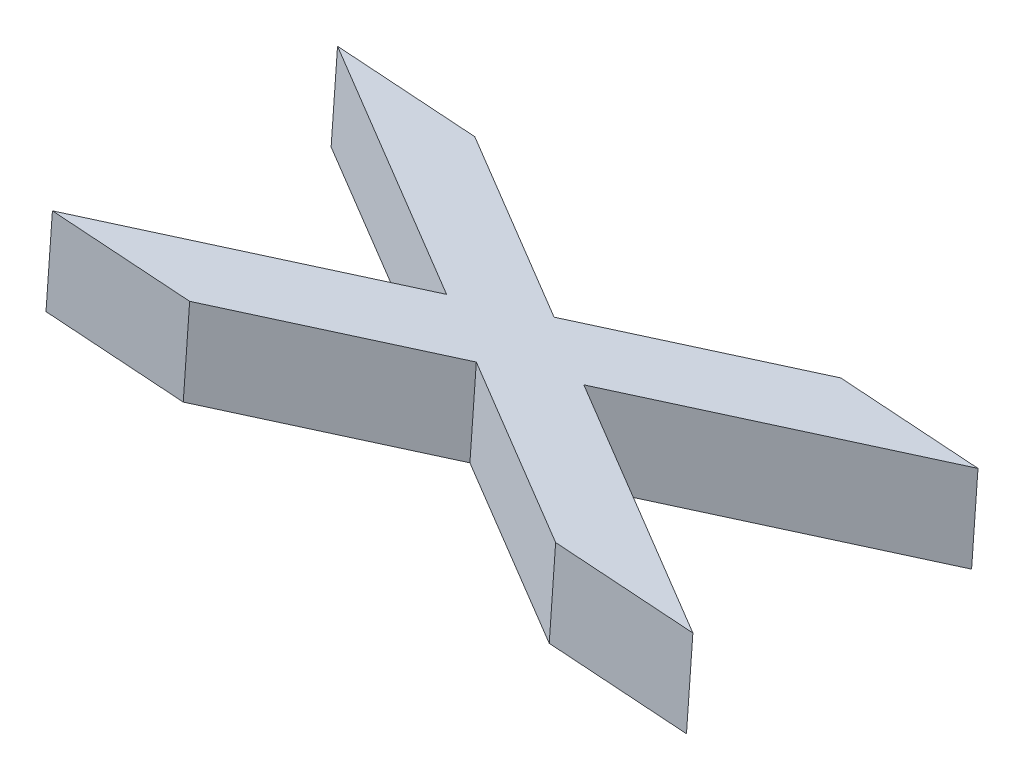
ISO-10303-21;
HEADER;
FILE_DESCRIPTION(('STEP AP214'),'2;1');
FILE_NAME('part.step','',(''),(''),'','','');
FILE_SCHEMA(('AUTOMOTIVE_DESIGN { 1 0 10303 214 1 1 1 1 }'));
ENDSEC;
DATA;
#1=APPLICATION_CONTEXT('core data for automotive mechanical design processes');
#2=APPLICATION_PROTOCOL_DEFINITION('international standard','automotive_design',2000,#1);
#3=PRODUCT_CONTEXT('',#1,'mechanical');
#4=PRODUCT('Part','Part','',(#3));
#5=PRODUCT_RELATED_PRODUCT_CATEGORY('part','',(#4));
#6=PRODUCT_DEFINITION_FORMATION('','',#4);
#7=PRODUCT_DEFINITION_CONTEXT('part definition',#1,'design');
#8=PRODUCT_DEFINITION('design','',#6,#7);
#9=PRODUCT_DEFINITION_SHAPE('','',#8);
#10=(LENGTH_UNIT() NAMED_UNIT(*) SI_UNIT(.MILLI.,.METRE.));
#11=(NAMED_UNIT(*) PLANE_ANGLE_UNIT() SI_UNIT($,.RADIAN.));
#12=(NAMED_UNIT(*) SI_UNIT($,.STERADIAN.) SOLID_ANGLE_UNIT());
#13=UNCERTAINTY_MEASURE_WITH_UNIT(LENGTH_MEASURE(1.E-05),#10,'distance_accuracy_value','');
#14=(GEOMETRIC_REPRESENTATION_CONTEXT(3) GLOBAL_UNCERTAINTY_ASSIGNED_CONTEXT((#13)) GLOBAL_UNIT_ASSIGNED_CONTEXT((#10,
#11,#12)) REPRESENTATION_CONTEXT('',''));
#15=CARTESIAN_POINT('',(0.,0.,0.));
#16=DIRECTION('',(0.,0.,1.));
#17=DIRECTION('',(1.,0.,0.));
#18=AXIS2_PLACEMENT_3D('',#15,#16,#17);
#19=CARTESIAN_POINT('',(-30.9159553972598,40.5619474258667,66.6890590934387));
#20=DIRECTION('',(-0.490787922283679,0.0347583514365212,0.870585476760257));
#21=DIRECTION('',(0.871111849631045,0.,0.491084662184006));
#22=AXIS2_PLACEMENT_3D('',#19,#20,#21);
#23=PLANE('',#22);
#24=DIRECTION('',(0.868410362588615,-0.0615021503249728,0.492017202599782));
#25=VECTOR('',#24,1.);
#26=CARTESIAN_POINT('',(-30.2879250303581,49.4297362065182,66.6890590934387));
#27=LINE('',#26,#25);
#28=CARTESIAN_POINT('',(-48.2203250303581,50.6997362065182,56.5290590934387));
#29=VERTEX_POINT('',#28);
#30=CARTESIAN_POINT('',(-30.2879250303581,49.4297362065182,66.6890590934387));
#31=VERTEX_POINT('',#30);
#32=EDGE_CURVE('E156',#29,#31,#27,.T.);
#33=ORIENTED_EDGE('',*,*,#32,.F.);
#34=DIRECTION('',(0.0706445857032248,0.997501550129532,0.));
#35=VECTOR('',#34,1.);
#36=CARTESIAN_POINT('',(-48.8483553972598,41.8319474258667,56.5290590934387));
#37=LINE('',#36,#35);
#38=CARTESIAN_POINT('',(-48.8483553972598,41.8319474258667,56.5290590934387));
#39=VERTEX_POINT('',#38);
#40=EDGE_CURVE('E11',#39,#29,#37,.T.);
#41=ORIENTED_EDGE('',*,*,#40,.F.);
#42=DIRECTION('',(0.868410362588615,-0.0615021503249728,0.492017202599782));
#43=VECTOR('',#42,1.);
#44=CARTESIAN_POINT('',(-30.9159553972598,40.5619474258667,66.6890590934387));
#45=LINE('',#44,#43);
#46=CARTESIAN_POINT('',(-30.9159553972598,40.5619474258667,66.6890590934387));
#47=VERTEX_POINT('',#46);
#48=EDGE_CURVE('E188',#39,#47,#45,.T.);
#49=ORIENTED_EDGE('',*,*,#48,.T.);
#50=DIRECTION('',(0.0706445857032248,0.997501550129532,0.));
#51=VECTOR('',#50,1.);
#52=CARTESIAN_POINT('',(-30.9159553972598,40.5619474258667,66.6890590934387));
#53=LINE('',#52,#51);
#54=EDGE_CURVE('E38',#47,#31,#53,.T.);
#55=ORIENTED_EDGE('',*,*,#54,.T.);
#56=EDGE_LOOP('',(#33,#41,#49,#55));
#57=FACE_BOUND('',#56,.T.);
#58=ADVANCED_FACE('F35',(#57),#23,.T.);
#59=CARTESIAN_POINT('',(-66.7807553972598,43.1019474258667,66.6890590934386));
#60=DIRECTION('',(0.490787922283679,-0.0347583514365212,0.870585476760258));
#61=DIRECTION('',(0.871111849631045,0.,-0.491084662184006));
#62=AXIS2_PLACEMENT_3D('',#59,#60,#61);
#63=PLANE('',#62);
#64=DIRECTION('',(0.868410362588615,-0.0615021503249729,-0.492017202599782));
#65=VECTOR('',#64,1.);
#66=CARTESIAN_POINT('',(-66.1527250303581,51.9697362065182,66.6890590934386));
#67=LINE('',#66,#65);
#68=CARTESIAN_POINT('',(-66.1527250303581,51.9697362065182,66.6890590934386));
#69=VERTEX_POINT('',#68);
#70=EDGE_CURVE('E186',#69,#29,#67,.T.);
#71=ORIENTED_EDGE('',*,*,#70,.F.);
#72=DIRECTION('',(0.0706445857032248,0.997501550129532,0.));
#73=VECTOR('',#72,1.);
#74=CARTESIAN_POINT('',(-66.7807553972598,43.1019474258667,66.6890590934386));
#75=LINE('',#74,#73);
#76=CARTESIAN_POINT('',(-66.7807553972598,43.1019474258667,66.6890590934386));
#77=VERTEX_POINT('',#76);
#78=EDGE_CURVE('E44',#77,#69,#75,.T.);
#79=ORIENTED_EDGE('',*,*,#78,.F.);
#80=DIRECTION('',(0.868410362588615,-0.0615021503249729,-0.492017202599782));
#81=VECTOR('',#80,1.);
#82=CARTESIAN_POINT('',(-66.7807553972598,43.1019474258667,66.6890590934386));
#83=LINE('',#82,#81);
#84=EDGE_CURVE('E146',#77,#39,#83,.T.);
#85=ORIENTED_EDGE('',*,*,#84,.T.);
#86=ORIENTED_EDGE('',*,*,#40,.T.);
#87=EDGE_LOOP('',(#71,#79,#85,#86));
#88=FACE_BOUND('',#87,.T.);
#89=ADVANCED_FACE('F208',(#88),#63,.T.);
#90=CARTESIAN_POINT('',(-80.2300553972598,44.0544474258667,66.6890590934387));
#91=DIRECTION('',(0.,0.,1.));
#92=DIRECTION('',(1.,0.,0.));
#93=AXIS2_PLACEMENT_3D('',#90,#91,#92);
#94=PLANE('',#93);
#95=DIRECTION('',(0.997501550129532,-0.0706445857032248,0.));
#96=VECTOR('',#95,1.);
#97=CARTESIAN_POINT('',(-79.6020250303581,52.9222362065182,66.6890590934387));
#98=LINE('',#97,#96);
#99=CARTESIAN_POINT('',(-79.6020250303581,52.9222362065182,66.6890590934387));
#100=VERTEX_POINT('',#99);
#101=EDGE_CURVE('E133',#100,#69,#98,.T.);
#102=ORIENTED_EDGE('',*,*,#101,.F.);
#103=DIRECTION('',(0.0706445857032248,0.997501550129532,0.));
#104=VECTOR('',#103,1.);
#105=CARTESIAN_POINT('',(-80.2300553972598,44.0544474258667,66.6890590934387));
#106=LINE('',#105,#104);
#107=CARTESIAN_POINT('',(-80.2300553972598,44.0544474258667,66.6890590934387));
#108=VERTEX_POINT('',#107);
#109=EDGE_CURVE('E128',#108,#100,#106,.T.);
#110=ORIENTED_EDGE('',*,*,#109,.F.);
#111=DIRECTION('',(0.997501550129532,-0.0706445857032248,0.));
#112=VECTOR('',#111,1.);
#113=CARTESIAN_POINT('',(-80.2300553972598,44.0544474258667,66.6890590934387));
#114=LINE('',#113,#112);
#115=EDGE_CURVE('E131',#108,#77,#114,.T.);
#116=ORIENTED_EDGE('',*,*,#115,.T.);
#117=ORIENTED_EDGE('',*,*,#78,.T.);
#118=EDGE_LOOP('',(#102,#110,#116,#117));
#119=FACE_BOUND('',#118,.T.);
#120=ADVANCED_FACE('F130',(#119),#94,.T.);
#121=CARTESIAN_POINT('',(-55.5730053972598,42.3081974258667,52.7190590934387));
#122=DIRECTION('',(-0.490787922283679,0.0347583514365212,-0.870585476760258));
#123=DIRECTION('',(-0.871111849631045,0.,0.491084662184006));
#124=AXIS2_PLACEMENT_3D('',#121,#122,#123);
#125=PLANE('',#124);
#126=DIRECTION('',(-0.868410362588615,0.0615021503249729,0.492017202599782));
#127=VECTOR('',#126,1.);
#128=CARTESIAN_POINT('',(-54.9449750303581,51.1759862065182,52.7190590934387));
#129=LINE('',#128,#127);
#130=CARTESIAN_POINT('',(-54.9449750303581,51.1759862065182,52.7190590934387));
#131=VERTEX_POINT('',#130);
#132=EDGE_CURVE('E183',#131,#100,#129,.T.);
#133=ORIENTED_EDGE('',*,*,#132,.F.);
#134=DIRECTION('',(0.0706445857032248,0.997501550129532,0.));
#135=VECTOR('',#134,1.);
#136=CARTESIAN_POINT('',(-55.5730053972598,42.3081974258667,52.7190590934387));
#137=LINE('',#136,#135);
#138=CARTESIAN_POINT('',(-55.5730053972598,42.3081974258667,52.7190590934387));
#139=VERTEX_POINT('',#138);
#140=EDGE_CURVE('E138',#139,#131,#137,.T.);
#141=ORIENTED_EDGE('',*,*,#140,.F.);
#142=DIRECTION('',(-0.868410362588615,0.0615021503249729,0.492017202599782));
#143=VECTOR('',#142,1.);
#144=CARTESIAN_POINT('',(-55.5730053972598,42.3081974258667,52.7190590934387));
#145=LINE('',#144,#143);
#146=EDGE_CURVE('E144',#139,#108,#145,.T.);
#147=ORIENTED_EDGE('',*,*,#146,.T.);
#148=ORIENTED_EDGE('',*,*,#109,.T.);
#149=EDGE_LOOP('',(#133,#141,#147,#148));
#150=FACE_BOUND('',#149,.T.);
#151=ADVANCED_FACE('F148',(#150),#125,.T.);
#152=CARTESIAN_POINT('',(-55.5730053972598,42.3081974258667,52.7190590934387));
#153=DIRECTION('',(-0.490787922283679,0.0347583514365212,0.870585476760258));
#154=DIRECTION('',(0.871111849631045,0.,0.491084662184006));
#155=AXIS2_PLACEMENT_3D('',#152,#153,#154);
#156=PLANE('',#155);
#157=DIRECTION('',(0.868410362588615,-0.0615021503249729,0.492017202599782));
#158=VECTOR('',#157,1.);
#159=CARTESIAN_POINT('',(-54.9449750303581,51.1759862065182,52.7190590934387));
#160=LINE('',#159,#158);
#161=CARTESIAN_POINT('',(-79.6020250303581,52.9222362065182,38.7490590934387));
#162=VERTEX_POINT('',#161);
#163=EDGE_CURVE('E180',#162,#131,#160,.T.);
#164=ORIENTED_EDGE('',*,*,#163,.F.);
#165=DIRECTION('',(0.0706445857032248,0.997501550129532,0.));
#166=VECTOR('',#165,1.);
#167=CARTESIAN_POINT('',(-80.2300553972598,44.0544474258667,38.7490590934387));
#168=LINE('',#167,#166);
#169=CARTESIAN_POINT('',(-80.2300553972598,44.0544474258667,38.7490590934387));
#170=VERTEX_POINT('',#169);
#171=EDGE_CURVE('E192',#170,#162,#168,.T.);
#172=ORIENTED_EDGE('',*,*,#171,.F.);
#173=DIRECTION('',(0.868410362588615,-0.0615021503249729,0.492017202599782));
#174=VECTOR('',#173,1.);
#175=CARTESIAN_POINT('',(-55.5730053972598,42.3081974258667,52.7190590934387));
#176=LINE('',#175,#174);
#177=EDGE_CURVE('E149',#170,#139,#176,.T.);
#178=ORIENTED_EDGE('',*,*,#177,.T.);
#179=ORIENTED_EDGE('',*,*,#140,.T.);
#180=EDGE_LOOP('',(#164,#172,#178,#179));
#181=FACE_BOUND('',#180,.T.);
#182=ADVANCED_FACE('F221',(#181),#156,.T.);
#183=CARTESIAN_POINT('',(-80.2300553972598,44.0544474258667,38.7490590934387));
#184=DIRECTION('',(0.,0.,-1.));
#185=DIRECTION('',(-1.,0.,0.));
#186=AXIS2_PLACEMENT_3D('',#183,#184,#185);
#187=PLANE('',#186);
#188=DIRECTION('',(-0.997501550129532,0.070644585703225,0.));
#189=VECTOR('',#188,1.);
#190=CARTESIAN_POINT('',(-79.6020250303581,52.9222362065182,38.7490590934387));
#191=LINE('',#190,#189);
#192=CARTESIAN_POINT('',(-66.1527250303582,51.9697362065182,38.7490590934386));
#193=VERTEX_POINT('',#192);
#194=EDGE_CURVE('E177',#193,#162,#191,.T.);
#195=ORIENTED_EDGE('',*,*,#194,.F.);
#196=DIRECTION('',(0.0706445857032248,0.997501550129532,0.));
#197=VECTOR('',#196,1.);
#198=CARTESIAN_POINT('',(-66.7807553972598,43.1019474258667,38.7490590934386));
#199=LINE('',#198,#197);
#200=CARTESIAN_POINT('',(-66.7807553972598,43.1019474258667,38.7490590934386));
#201=VERTEX_POINT('',#200);
#202=EDGE_CURVE('E194',#201,#193,#199,.T.);
#203=ORIENTED_EDGE('',*,*,#202,.F.);
#204=DIRECTION('',(-0.997501550129532,0.070644585703225,0.));
#205=VECTOR('',#204,1.);
#206=CARTESIAN_POINT('',(-80.2300553972598,44.0544474258667,38.7490590934387));
#207=LINE('',#206,#205);
#208=EDGE_CURVE('E151',#201,#170,#207,.T.);
#209=ORIENTED_EDGE('',*,*,#208,.T.);
#210=ORIENTED_EDGE('',*,*,#171,.T.);
#211=EDGE_LOOP('',(#195,#203,#209,#210));
#212=FACE_BOUND('',#211,.T.);
#213=ADVANCED_FACE('F224',(#212),#187,.T.);
#214=CARTESIAN_POINT('',(-66.7807553972598,43.1019474258667,38.7490590934386));
#215=DIRECTION('',(0.490787922283679,-0.0347583514365212,-0.870585476760258));
#216=DIRECTION('',(-0.871111849631045,0.,-0.491084662184006));
#217=AXIS2_PLACEMENT_3D('',#214,#215,#216);
#218=PLANE('',#217);
#219=DIRECTION('',(-0.868410362588615,0.0615021503249727,-0.492017202599782));
#220=VECTOR('',#219,1.);
#221=CARTESIAN_POINT('',(-66.1527250303582,51.9697362065182,38.7490590934386));
#222=LINE('',#221,#220);
#223=CARTESIAN_POINT('',(-48.2203250303581,50.6997362065182,48.9090590934387));
#224=VERTEX_POINT('',#223);
#225=EDGE_CURVE('E174',#224,#193,#222,.T.);
#226=ORIENTED_EDGE('',*,*,#225,.F.);
#227=DIRECTION('',(0.0706445857032248,0.997501550129532,0.));
#228=VECTOR('',#227,1.);
#229=CARTESIAN_POINT('',(-48.8483553972598,41.8319474258667,48.9090590934387));
#230=LINE('',#229,#228);
#231=CARTESIAN_POINT('',(-48.8483553972598,41.8319474258667,48.9090590934387));
#232=VERTEX_POINT('',#231);
#233=EDGE_CURVE('E196',#232,#224,#230,.T.);
#234=ORIENTED_EDGE('',*,*,#233,.F.);
#235=DIRECTION('',(-0.868410362588615,0.0615021503249727,-0.492017202599782));
#236=VECTOR('',#235,1.);
#237=CARTESIAN_POINT('',(-66.7807553972598,43.1019474258667,38.7490590934386));
#238=LINE('',#237,#236);
#239=EDGE_CURVE('E350',#232,#201,#238,.T.);
#240=ORIENTED_EDGE('',*,*,#239,.T.);
#241=ORIENTED_EDGE('',*,*,#202,.T.);
#242=EDGE_LOOP('',(#226,#234,#240,#241));
#243=FACE_BOUND('',#242,.T.);
#244=ADVANCED_FACE('F228',(#243),#218,.T.);
#245=CARTESIAN_POINT('',(-30.9159553972598,40.5619474258667,38.7490590934387));
#246=DIRECTION('',(-0.490787922283678,0.0347583514365212,-0.870585476760258));
#247=DIRECTION('',(-0.871111849631045,0.,0.491084662184006));
#248=AXIS2_PLACEMENT_3D('',#245,#246,#247);
#249=PLANE('',#248);
#250=DIRECTION('',(-0.868410362588615,0.0615021503249727,0.492017202599782));
#251=VECTOR('',#250,1.);
#252=CARTESIAN_POINT('',(-30.2879250303581,49.4297362065182,38.7490590934387));
#253=LINE('',#252,#251);
#254=CARTESIAN_POINT('',(-30.2879250303581,49.4297362065182,38.7490590934387));
#255=VERTEX_POINT('',#254);
#256=EDGE_CURVE('E171',#255,#224,#253,.T.);
#257=ORIENTED_EDGE('',*,*,#256,.F.);
#258=DIRECTION('',(0.0706445857032248,0.997501550129532,0.));
#259=VECTOR('',#258,1.);
#260=CARTESIAN_POINT('',(-30.9159553972598,40.5619474258667,38.7490590934387));
#261=LINE('',#260,#259);
#262=CARTESIAN_POINT('',(-30.9159553972598,40.5619474258667,38.7490590934387));
#263=VERTEX_POINT('',#262);
#264=EDGE_CURVE('E198',#263,#255,#261,.T.);
#265=ORIENTED_EDGE('',*,*,#264,.F.);
#266=DIRECTION('',(-0.868410362588615,0.0615021503249727,0.492017202599782));
#267=VECTOR('',#266,1.);
#268=CARTESIAN_POINT('',(-30.9159553972598,40.5619474258667,38.7490590934387));
#269=LINE('',#268,#267);
#270=EDGE_CURVE('E354',#263,#232,#269,.T.);
#271=ORIENTED_EDGE('',*,*,#270,.T.);
#272=ORIENTED_EDGE('',*,*,#233,.T.);
#273=EDGE_LOOP('',(#257,#265,#271,#272));
#274=FACE_BOUND('',#273,.T.);
#275=ADVANCED_FACE('F232',(#274),#249,.T.);
#276=CARTESIAN_POINT('',(-17.4666553972598,39.6094474258667,38.7490590934387));
#277=DIRECTION('',(0.,0.,-1.));
#278=DIRECTION('',(-1.,0.,0.));
#279=AXIS2_PLACEMENT_3D('',#276,#277,#278);
#280=PLANE('',#279);
#281=DIRECTION('',(-0.997501550129532,0.0706445857032249,0.));
#282=VECTOR('',#281,1.);
#283=CARTESIAN_POINT('',(-16.8386250303582,48.4772362065182,38.7490590934387));
#284=LINE('',#283,#282);
#285=CARTESIAN_POINT('',(-16.8386250303582,48.4772362065182,38.7490590934387));
#286=VERTEX_POINT('',#285);
#287=EDGE_CURVE('E168',#286,#255,#284,.T.);
#288=ORIENTED_EDGE('',*,*,#287,.F.);
#289=DIRECTION('',(0.0706445857032248,0.997501550129532,0.));
#290=VECTOR('',#289,1.);
#291=CARTESIAN_POINT('',(-17.4666553972598,39.6094474258667,38.7490590934387));
#292=LINE('',#291,#290);
#293=CARTESIAN_POINT('',(-17.4666553972598,39.6094474258667,38.7490590934387));
#294=VERTEX_POINT('',#293);
#295=EDGE_CURVE('E200',#294,#286,#292,.T.);
#296=ORIENTED_EDGE('',*,*,#295,.F.);
#297=DIRECTION('',(-0.997501550129532,0.0706445857032249,0.));
#298=VECTOR('',#297,1.);
#299=CARTESIAN_POINT('',(-17.4666553972598,39.6094474258667,38.7490590934387));
#300=LINE('',#299,#298);
#301=EDGE_CURVE('E343',#294,#263,#300,.T.);
#302=ORIENTED_EDGE('',*,*,#301,.T.);
#303=ORIENTED_EDGE('',*,*,#264,.T.);
#304=EDGE_LOOP('',(#288,#296,#302,#303));
#305=FACE_BOUND('',#304,.T.);
#306=ADVANCED_FACE('F236',(#305),#280,.T.);
#307=CARTESIAN_POINT('',(-42.1237053972598,41.3556974258667,52.7190590934387));
#308=DIRECTION('',(0.490787922283679,-0.0347583514365212,0.870585476760258));
#309=DIRECTION('',(0.871111849631045,0.,-0.491084662184006));
#310=AXIS2_PLACEMENT_3D('',#307,#308,#309);
#311=PLANE('',#310);
#312=DIRECTION('',(0.868410362588615,-0.0615021503249727,-0.492017202599782));
#313=VECTOR('',#312,1.);
#314=CARTESIAN_POINT('',(-41.4956750303581,50.2234862065182,52.7190590934387));
#315=LINE('',#314,#313);
#316=CARTESIAN_POINT('',(-41.4956750303581,50.2234862065182,52.7190590934387));
#317=VERTEX_POINT('',#316);
#318=EDGE_CURVE('E165',#317,#286,#315,.T.);
#319=ORIENTED_EDGE('',*,*,#318,.F.);
#320=DIRECTION('',(0.0706445857032248,0.997501550129532,0.));
#321=VECTOR('',#320,1.);
#322=CARTESIAN_POINT('',(-42.1237053972598,41.3556974258667,52.7190590934387));
#323=LINE('',#322,#321);
#324=CARTESIAN_POINT('',(-42.1237053972598,41.3556974258667,52.7190590934387));
#325=VERTEX_POINT('',#324);
#326=EDGE_CURVE('E202',#325,#317,#323,.T.);
#327=ORIENTED_EDGE('',*,*,#326,.F.);
#328=DIRECTION('',(0.868410362588615,-0.0615021503249727,-0.492017202599782));
#329=VECTOR('',#328,1.);
#330=CARTESIAN_POINT('',(-42.1237053972598,41.3556974258667,52.7190590934387));
#331=LINE('',#330,#329);
#332=EDGE_CURVE('E339',#325,#294,#331,.T.);
#333=ORIENTED_EDGE('',*,*,#332,.T.);
#334=ORIENTED_EDGE('',*,*,#295,.T.);
#335=EDGE_LOOP('',(#319,#327,#333,#334));
#336=FACE_BOUND('',#335,.T.);
#337=ADVANCED_FACE('F240',(#336),#311,.T.);
#338=CARTESIAN_POINT('',(-42.1237053972598,41.3556974258667,52.7190590934387));
#339=DIRECTION('',(0.490787922283678,-0.0347583514365212,-0.870585476760258));
#340=DIRECTION('',(-0.871111849631045,0.,-0.491084662184006));
#341=AXIS2_PLACEMENT_3D('',#338,#339,#340);
#342=PLANE('',#341);
#343=DIRECTION('',(-0.868410362588615,0.0615021503249727,-0.492017202599782));
#344=VECTOR('',#343,1.);
#345=CARTESIAN_POINT('',(-41.4956750303581,50.2234862065182,52.7190590934387));
#346=LINE('',#345,#344);
#347=CARTESIAN_POINT('',(-16.8386250303581,48.4772362065182,66.6890590934387));
#348=VERTEX_POINT('',#347);
#349=EDGE_CURVE('E162',#348,#317,#346,.T.);
#350=ORIENTED_EDGE('',*,*,#349,.F.);
#351=DIRECTION('',(0.0706445857032248,0.997501550129532,0.));
#352=VECTOR('',#351,1.);
#353=CARTESIAN_POINT('',(-17.4666553972598,39.6094474258667,66.6890590934387));
#354=LINE('',#353,#352);
#355=CARTESIAN_POINT('',(-17.4666553972598,39.6094474258667,66.6890590934387));
#356=VERTEX_POINT('',#355);
#357=EDGE_CURVE('E203',#356,#348,#354,.T.);
#358=ORIENTED_EDGE('',*,*,#357,.F.);
#359=DIRECTION('',(-0.868410362588615,0.0615021503249727,-0.492017202599782));
#360=VECTOR('',#359,1.);
#361=CARTESIAN_POINT('',(-42.1237053972598,41.3556974258667,52.7190590934387));
#362=LINE('',#361,#360);
#363=EDGE_CURVE('E360',#356,#325,#362,.T.);
#364=ORIENTED_EDGE('',*,*,#363,.T.);
#365=ORIENTED_EDGE('',*,*,#326,.T.);
#366=EDGE_LOOP('',(#350,#358,#364,#365));
#367=FACE_BOUND('',#366,.T.);
#368=ADVANCED_FACE('F244',(#367),#342,.T.);
#369=CARTESIAN_POINT('',(-17.4666553972598,39.6094474258667,66.6890590934387));
#370=DIRECTION('',(0.,0.,1.));
#371=DIRECTION('',(1.,0.,0.));
#372=AXIS2_PLACEMENT_3D('',#369,#370,#371);
#373=PLANE('',#372);
#374=DIRECTION('',(0.997501550129532,-0.0706445857032248,0.));
#375=VECTOR('',#374,1.);
#376=CARTESIAN_POINT('',(-16.8386250303581,48.4772362065182,66.6890590934387));
#377=LINE('',#376,#375);
#378=EDGE_CURVE('E159',#31,#348,#377,.T.);
#379=ORIENTED_EDGE('',*,*,#378,.F.);
#380=ORIENTED_EDGE('',*,*,#54,.F.);
#381=DIRECTION('',(0.997501550129532,-0.0706445857032248,0.));
#382=VECTOR('',#381,1.);
#383=CARTESIAN_POINT('',(-17.4666553972598,39.6094474258667,66.6890590934387));
#384=LINE('',#383,#382);
#385=EDGE_CURVE('E362',#47,#356,#384,.T.);
#386=ORIENTED_EDGE('',*,*,#385,.T.);
#387=ORIENTED_EDGE('',*,*,#357,.T.);
#388=EDGE_LOOP('',(#379,#380,#386,#387));
#389=FACE_BOUND('',#388,.T.);
#390=ADVANCED_FACE('F205',(#389),#373,.T.);
#391=CARTESIAN_POINT('',(2.70403176381803,38.1809285051105,0.));
#392=DIRECTION('',(-0.0706445857032248,-0.997501550129532,0.));
#393=DIRECTION('',(0.997501550129532,-0.0706445857032248,0.));
#394=AXIS2_PLACEMENT_3D('',#391,#392,#393);
#395=PLANE('',#394);
#396=ORIENTED_EDGE('',*,*,#48,.F.);
#397=ORIENTED_EDGE('',*,*,#84,.F.);
#398=ORIENTED_EDGE('',*,*,#115,.F.);
#399=ORIENTED_EDGE('',*,*,#146,.F.);
#400=ORIENTED_EDGE('',*,*,#177,.F.);
#401=ORIENTED_EDGE('',*,*,#208,.F.);
#402=ORIENTED_EDGE('',*,*,#239,.F.);
#403=ORIENTED_EDGE('',*,*,#270,.F.);
#404=ORIENTED_EDGE('',*,*,#301,.F.);
#405=ORIENTED_EDGE('',*,*,#332,.F.);
#406=ORIENTED_EDGE('',*,*,#363,.F.);
#407=ORIENTED_EDGE('',*,*,#385,.F.);
#408=EDGE_LOOP('',(#396,#397,#398,#399,#400,#401,#402,#403,#404,#405,#406,#407));
#409=FACE_BOUND('',#408,.T.);
#410=ADVANCED_FACE('F142',(#409),#395,.T.);
#411=CARTESIAN_POINT('',(3.33206213071969,47.048717285762,0.));
#412=DIRECTION('',(-0.0706445857032248,-0.997501550129532,0.));
#413=DIRECTION('',(0.997501550129532,-0.0706445857032248,0.));
#414=AXIS2_PLACEMENT_3D('',#411,#412,#413);
#415=PLANE('',#414);
#416=ORIENTED_EDGE('',*,*,#32,.T.);
#417=ORIENTED_EDGE('',*,*,#378,.T.);
#418=ORIENTED_EDGE('',*,*,#349,.T.);
#419=ORIENTED_EDGE('',*,*,#318,.T.);
#420=ORIENTED_EDGE('',*,*,#287,.T.);
#421=ORIENTED_EDGE('',*,*,#256,.T.);
#422=ORIENTED_EDGE('',*,*,#225,.T.);
#423=ORIENTED_EDGE('',*,*,#194,.T.);
#424=ORIENTED_EDGE('',*,*,#163,.T.);
#425=ORIENTED_EDGE('',*,*,#132,.T.);
#426=ORIENTED_EDGE('',*,*,#101,.T.);
#427=ORIENTED_EDGE('',*,*,#70,.T.);
#428=EDGE_LOOP('',(#416,#417,#418,#419,#420,#421,#422,#423,#424,#425,#426,#427));
#429=FACE_BOUND('',#428,.T.);
#430=ADVANCED_FACE('F207',(#429),#415,.F.);
#431=CLOSED_SHELL('',(#58,#89,#120,#151,#182,#213,#244,#275,#306,#337,#368,#390,#410,#430));
#432=MANIFOLD_SOLID_BREP('B2',#431);
#433=ADVANCED_BREP_SHAPE_REPRESENTATION('',(#18,#432),#14);
#434=SHAPE_DEFINITION_REPRESENTATION(#9,#433);
ENDSEC;
END-ISO-10303-21;
